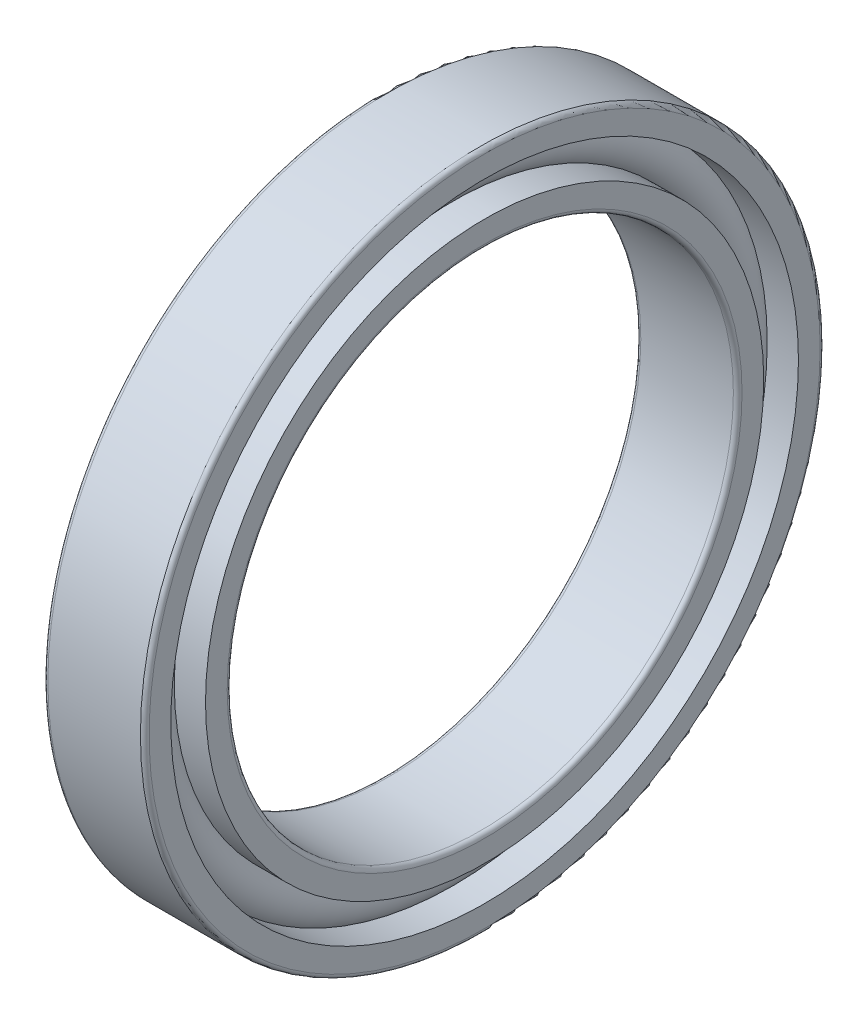
ISO-10303-21;
HEADER;
FILE_DESCRIPTION(('STEP AP214'),'2;1');
FILE_NAME('part.step','',(''),(''),'','','');
FILE_SCHEMA(('AUTOMOTIVE_DESIGN { 1 0 10303 214 1 1 1 1 }'));
ENDSEC;
DATA;
#1=APPLICATION_CONTEXT('core data for automotive mechanical design processes');
#2=APPLICATION_PROTOCOL_DEFINITION('international standard','automotive_design',2000,#1);
#3=PRODUCT_CONTEXT('',#1,'mechanical');
#4=PRODUCT('Part','Part','',(#3));
#5=PRODUCT_RELATED_PRODUCT_CATEGORY('part','',(#4));
#6=PRODUCT_DEFINITION_FORMATION('','',#4);
#7=PRODUCT_DEFINITION_CONTEXT('part definition',#1,'design');
#8=PRODUCT_DEFINITION('design','',#6,#7);
#9=PRODUCT_DEFINITION_SHAPE('','',#8);
#10=(LENGTH_UNIT() NAMED_UNIT(*) SI_UNIT(.MILLI.,.METRE.));
#11=(NAMED_UNIT(*) PLANE_ANGLE_UNIT() SI_UNIT($,.RADIAN.));
#12=(NAMED_UNIT(*) SI_UNIT($,.STERADIAN.) SOLID_ANGLE_UNIT());
#13=UNCERTAINTY_MEASURE_WITH_UNIT(LENGTH_MEASURE(1.E-05),#10,'distance_accuracy_value','');
#14=(GEOMETRIC_REPRESENTATION_CONTEXT(3) GLOBAL_UNCERTAINTY_ASSIGNED_CONTEXT((#13)) GLOBAL_UNIT_ASSIGNED_CONTEXT((#10,
#11,#12)) REPRESENTATION_CONTEXT('',''));
#15=CARTESIAN_POINT('',(0.,0.,0.));
#16=DIRECTION('',(0.,0.,1.));
#17=DIRECTION('',(1.,0.,0.));
#18=AXIS2_PLACEMENT_3D('',#15,#16,#17);
#19=CARTESIAN_POINT('',(0.,0.,0.));
#20=DIRECTION('',(-1.,0.,0.));
#21=DIRECTION('',(0.,0.,1.));
#22=AXIS2_PLACEMENT_3D('',#19,#20,#21);
#23=TOROIDAL_SURFACE('',#22,20.5,1.8);
#24=CARTESIAN_POINT('',(1.34164078649987,0.,0.));
#25=DIRECTION('',(-1.,0.,0.));
#26=DIRECTION('',(0.,0.,1.));
#27=AXIS2_PLACEMENT_3D('',#24,#25,#26);
#28=CIRCLE('',#27,21.7);
#29=CARTESIAN_POINT('',(1.34164078649987,0.,21.7));
#30=VERTEX_POINT('',#29);
#31=EDGE_CURVE('E36',#30,#30,#28,.F.);
#32=ORIENTED_EDGE('',*,*,#31,.T.);
#33=EDGE_LOOP('',(#32));
#34=FACE_BOUND('',#33,.T.);
#35=CARTESIAN_POINT('',(1.34164078649987,0.,0.));
#36=DIRECTION('',(-1.,0.,0.));
#37=DIRECTION('',(0.,0.,1.));
#38=AXIS2_PLACEMENT_3D('',#35,#36,#37);
#39=CIRCLE('',#38,19.3);
#40=CARTESIAN_POINT('',(1.34164078649987,0.,19.3));
#41=VERTEX_POINT('',#40);
#42=EDGE_CURVE('E10',#41,#41,#39,.T.);
#43=ORIENTED_EDGE('',*,*,#42,.T.);
#44=EDGE_LOOP('',(#43));
#45=FACE_BOUND('',#44,.T.);
#46=ADVANCED_FACE('F32',(#34,#45),#23,.T.);
#47=CARTESIAN_POINT('',(-20.6375,0.,0.));
#48=DIRECTION('',(1.,0.,0.));
#49=DIRECTION('',(0.,0.,-1.));
#50=AXIS2_PLACEMENT_3D('',#47,#48,#49);
#51=CYLINDRICAL_SURFACE('',#50,19.3);
#52=CARTESIAN_POINT('',(3.5,0.,0.));
#53=DIRECTION('',(1.,0.,0.));
#54=DIRECTION('',(0.,0.,-1.));
#55=AXIS2_PLACEMENT_3D('',#52,#53,#54);
#56=CIRCLE('',#55,19.3);
#57=CARTESIAN_POINT('',(3.5,0.,-19.3));
#58=VERTEX_POINT('',#57);
#59=EDGE_CURVE('E45',#58,#58,#56,.T.);
#60=ORIENTED_EDGE('',*,*,#59,.F.);
#61=EDGE_LOOP('',(#60));
#62=FACE_BOUND('',#61,.T.);
#63=ORIENTED_EDGE('',*,*,#42,.F.);
#64=EDGE_LOOP('',(#63));
#65=FACE_BOUND('',#64,.T.);
#66=ADVANCED_FACE('F84',(#62,#65),#51,.T.);
#67=CARTESIAN_POINT('',(-20.6375,0.,0.));
#68=DIRECTION('',(1.,0.,0.));
#69=DIRECTION('',(0.,0.,-1.));
#70=AXIS2_PLACEMENT_3D('',#67,#68,#69);
#71=CYLINDRICAL_SURFACE('',#70,19.3);
#72=CARTESIAN_POINT('',(-3.5,0.,0.));
#73=DIRECTION('',(1.,0.,0.));
#74=DIRECTION('',(0.,0.,-1.));
#75=AXIS2_PLACEMENT_3D('',#72,#73,#74);
#76=CIRCLE('',#75,19.3);
#77=CARTESIAN_POINT('',(-3.5,0.,-19.3));
#78=VERTEX_POINT('',#77);
#79=EDGE_CURVE('E54',#78,#78,#76,.T.);
#80=ORIENTED_EDGE('',*,*,#79,.T.);
#81=EDGE_LOOP('',(#80));
#82=FACE_BOUND('',#81,.T.);
#83=CARTESIAN_POINT('',(-1.34164078649987,0.,0.));
#84=DIRECTION('',(1.,0.,0.));
#85=DIRECTION('',(0.,0.,-1.));
#86=AXIS2_PLACEMENT_3D('',#83,#84,#85);
#87=CIRCLE('',#86,19.3);
#88=CARTESIAN_POINT('',(-1.34164078649987,0.,-19.3));
#89=VERTEX_POINT('',#88);
#90=EDGE_CURVE('E40',#89,#89,#87,.T.);
#91=ORIENTED_EDGE('',*,*,#90,.F.);
#92=EDGE_LOOP('',(#91));
#93=FACE_BOUND('',#92,.T.);
#94=ADVANCED_FACE('F87',(#82,#93),#71,.T.);
#95=CARTESIAN_POINT('',(3.5,17.8,0.));
#96=DIRECTION('',(1.,0.,0.));
#97=DIRECTION('',(0.,0.,-1.));
#98=AXIS2_PLACEMENT_3D('',#95,#96,#97);
#99=PLANE('',#98);
#100=ORIENTED_EDGE('',*,*,#59,.T.);
#101=EDGE_LOOP('',(#100));
#102=FACE_BOUND('',#101,.T.);
#103=CARTESIAN_POINT('',(3.5,0.,0.));
#104=DIRECTION('',(1.,0.,0.));
#105=DIRECTION('',(0.,0.,-1.));
#106=AXIS2_PLACEMENT_3D('',#103,#104,#105);
#107=CIRCLE('',#106,17.8);
#108=CARTESIAN_POINT('',(3.5,0.,-17.8));
#109=VERTEX_POINT('',#108);
#110=EDGE_CURVE('E76',#109,#109,#107,.T.);
#111=ORIENTED_EDGE('',*,*,#110,.F.);
#112=EDGE_LOOP('',(#111));
#113=FACE_BOUND('',#112,.T.);
#114=ADVANCED_FACE('F81',(#102,#113),#99,.T.);
#115=CARTESIAN_POINT('',(3.2,0.,0.));
#116=DIRECTION('',(1.,0.,0.));
#117=DIRECTION('',(0.,0.,-1.));
#118=AXIS2_PLACEMENT_3D('',#115,#116,#117);
#119=TOROIDAL_SURFACE('',#118,17.8,0.300000000000001);
#120=ORIENTED_EDGE('',*,*,#110,.T.);
#121=EDGE_LOOP('',(#120));
#122=FACE_BOUND('',#121,.T.);
#123=CARTESIAN_POINT('',(3.2,0.,0.));
#124=DIRECTION('',(1.,0.,0.));
#125=DIRECTION('',(0.,0.,-1.));
#126=AXIS2_PLACEMENT_3D('',#123,#124,#125);
#127=CIRCLE('',#126,17.5);
#128=CARTESIAN_POINT('',(3.2,0.,-17.5));
#129=VERTEX_POINT('',#128);
#130=EDGE_CURVE('E73',#129,#129,#127,.T.);
#131=ORIENTED_EDGE('',*,*,#130,.F.);
#132=EDGE_LOOP('',(#131));
#133=FACE_BOUND('',#132,.T.);
#134=ADVANCED_FACE('F98',(#122,#133),#119,.T.);
#135=CARTESIAN_POINT('',(-20.6375,0.,0.));
#136=DIRECTION('',(1.,0.,0.));
#137=DIRECTION('',(0.,0.,-1.));
#138=AXIS2_PLACEMENT_3D('',#135,#136,#137);
#139=CYLINDRICAL_SURFACE('',#138,17.5);
#140=ORIENTED_EDGE('',*,*,#130,.T.);
#141=EDGE_LOOP('',(#140));
#142=FACE_BOUND('',#141,.T.);
#143=CARTESIAN_POINT('',(-3.2,0.,0.));
#144=DIRECTION('',(1.,0.,0.));
#145=DIRECTION('',(0.,0.,-1.));
#146=AXIS2_PLACEMENT_3D('',#143,#144,#145);
#147=CIRCLE('',#146,17.5);
#148=CARTESIAN_POINT('',(-3.2,0.,-17.5));
#149=VERTEX_POINT('',#148);
#150=EDGE_CURVE('E70',#149,#149,#147,.T.);
#151=ORIENTED_EDGE('',*,*,#150,.F.);
#152=EDGE_LOOP('',(#151));
#153=FACE_BOUND('',#152,.T.);
#154=ADVANCED_FACE('F101',(#142,#153),#139,.F.);
#155=CARTESIAN_POINT('',(-3.2,0.,0.));
#156=DIRECTION('',(1.,0.,0.));
#157=DIRECTION('',(0.,0.,-1.));
#158=AXIS2_PLACEMENT_3D('',#155,#156,#157);
#159=TOROIDAL_SURFACE('',#158,17.8,0.300000000000001);
#160=ORIENTED_EDGE('',*,*,#150,.T.);
#161=EDGE_LOOP('',(#160));
#162=FACE_BOUND('',#161,.T.);
#163=CARTESIAN_POINT('',(-3.5,0.,0.));
#164=DIRECTION('',(1.,0.,0.));
#165=DIRECTION('',(0.,0.,-1.));
#166=AXIS2_PLACEMENT_3D('',#163,#164,#165);
#167=CIRCLE('',#166,17.8);
#168=CARTESIAN_POINT('',(-3.5,0.,-17.8));
#169=VERTEX_POINT('',#168);
#170=EDGE_CURVE('E67',#169,#169,#167,.T.);
#171=ORIENTED_EDGE('',*,*,#170,.F.);
#172=EDGE_LOOP('',(#171));
#173=FACE_BOUND('',#172,.T.);
#174=ADVANCED_FACE('F105',(#162,#173),#159,.T.);
#175=CARTESIAN_POINT('',(-3.5,19.3,0.));
#176=DIRECTION('',(-1.,0.,0.));
#177=DIRECTION('',(0.,0.,1.));
#178=AXIS2_PLACEMENT_3D('',#175,#176,#177);
#179=PLANE('',#178);
#180=ORIENTED_EDGE('',*,*,#170,.T.);
#181=EDGE_LOOP('',(#180));
#182=FACE_BOUND('',#181,.T.);
#183=ORIENTED_EDGE('',*,*,#79,.F.);
#184=EDGE_LOOP('',(#183));
#185=FACE_BOUND('',#184,.T.);
#186=ADVANCED_FACE('F109',(#182,#185),#179,.T.);
#187=CARTESIAN_POINT('',(-1.34164078649987,0.,0.));
#188=DIRECTION('',(1.,0.,0.));
#189=DIRECTION('',(0.,0.,-1.));
#190=AXIS2_PLACEMENT_3D('',#187,#188,#189);
#191=CIRCLE('',#190,21.7);
#192=CARTESIAN_POINT('',(-1.34164078649987,0.,-21.7));
#193=VERTEX_POINT('',#192);
#194=EDGE_CURVE('E48',#193,#193,#191,.F.);
#195=ORIENTED_EDGE('',*,*,#194,.T.);
#196=EDGE_LOOP('',(#195));
#197=FACE_BOUND('',#196,.T.);
#198=ORIENTED_EDGE('',*,*,#90,.T.);
#199=EDGE_LOOP('',(#198));
#200=FACE_BOUND('',#199,.T.);
#201=ADVANCED_FACE('F34',(#197,#200),#23,.T.);
#202=CARTESIAN_POINT('',(-20.6375,0.,0.));
#203=DIRECTION('',(1.,0.,0.));
#204=DIRECTION('',(0.,0.,-1.));
#205=AXIS2_PLACEMENT_3D('',#202,#203,#204);
#206=CYLINDRICAL_SURFACE('',#205,21.7);
#207=CARTESIAN_POINT('',(3.5,0.,0.));
#208=DIRECTION('',(1.,0.,0.));
#209=DIRECTION('',(0.,0.,-1.));
#210=AXIS2_PLACEMENT_3D('',#207,#208,#209);
#211=CIRCLE('',#210,21.7);
#212=CARTESIAN_POINT('',(3.5,0.,-21.7));
#213=VERTEX_POINT('',#212);
#214=EDGE_CURVE('E50',#213,#213,#211,.T.);
#215=ORIENTED_EDGE('',*,*,#214,.T.);
#216=EDGE_LOOP('',(#215));
#217=FACE_BOUND('',#216,.T.);
#218=ORIENTED_EDGE('',*,*,#31,.F.);
#219=EDGE_LOOP('',(#218));
#220=FACE_BOUND('',#219,.T.);
#221=ADVANCED_FACE('F114',(#217,#220),#206,.F.);
#222=CARTESIAN_POINT('',(-20.6375,0.,0.));
#223=DIRECTION('',(1.,0.,0.));
#224=DIRECTION('',(0.,0.,-1.));
#225=AXIS2_PLACEMENT_3D('',#222,#223,#224);
#226=CYLINDRICAL_SURFACE('',#225,21.7);
#227=CARTESIAN_POINT('',(-3.5,0.,0.));
#228=DIRECTION('',(1.,0.,0.));
#229=DIRECTION('',(0.,0.,-1.));
#230=AXIS2_PLACEMENT_3D('',#227,#228,#229);
#231=CIRCLE('',#230,21.7);
#232=CARTESIAN_POINT('',(-3.5,0.,-21.7));
#233=VERTEX_POINT('',#232);
#234=EDGE_CURVE('E145',#233,#233,#231,.T.);
#235=ORIENTED_EDGE('',*,*,#234,.F.);
#236=EDGE_LOOP('',(#235));
#237=FACE_BOUND('',#236,.T.);
#238=ORIENTED_EDGE('',*,*,#194,.F.);
#239=EDGE_LOOP('',(#238));
#240=FACE_BOUND('',#239,.T.);
#241=ADVANCED_FACE('F117',(#237,#240),#226,.F.);
#242=CARTESIAN_POINT('',(3.50000000000001,23.2,0.));
#243=DIRECTION('',(1.,0.,0.));
#244=DIRECTION('',(0.,0.,-1.));
#245=AXIS2_PLACEMENT_3D('',#242,#243,#244);
#246=PLANE('',#245);
#247=CARTESIAN_POINT('',(3.50000000000001,0.,0.));
#248=DIRECTION('',(1.,0.,0.));
#249=DIRECTION('',(0.,0.,-1.));
#250=AXIS2_PLACEMENT_3D('',#247,#248,#249);
#251=CIRCLE('',#250,23.2);
#252=CARTESIAN_POINT('',(3.50000000000001,0.,-23.2));
#253=VERTEX_POINT('',#252);
#254=EDGE_CURVE('E56',#253,#253,#251,.T.);
#255=ORIENTED_EDGE('',*,*,#254,.T.);
#256=EDGE_LOOP('',(#255));
#257=FACE_BOUND('',#256,.T.);
#258=ORIENTED_EDGE('',*,*,#214,.F.);
#259=EDGE_LOOP('',(#258));
#260=FACE_BOUND('',#259,.T.);
#261=ADVANCED_FACE('F118',(#257,#260),#246,.T.);
#262=CARTESIAN_POINT('',(3.2,0.,0.));
#263=DIRECTION('',(1.,0.,0.));
#264=DIRECTION('',(0.,0.,-1.));
#265=AXIS2_PLACEMENT_3D('',#262,#263,#264);
#266=TOROIDAL_SURFACE('',#265,23.2,0.300000000000006);
#267=CARTESIAN_POINT('',(3.2,0.,0.));
#268=DIRECTION('',(1.,0.,0.));
#269=DIRECTION('',(0.,0.,-1.));
#270=AXIS2_PLACEMENT_3D('',#267,#268,#269);
#271=CIRCLE('',#270,23.5);
#272=CARTESIAN_POINT('',(3.2,0.,-23.5));
#273=VERTEX_POINT('',#272);
#274=EDGE_CURVE('E61',#273,#273,#271,.T.);
#275=ORIENTED_EDGE('',*,*,#274,.T.);
#276=EDGE_LOOP('',(#275));
#277=FACE_BOUND('',#276,.T.);
#278=ORIENTED_EDGE('',*,*,#254,.F.);
#279=EDGE_LOOP('',(#278));
#280=FACE_BOUND('',#279,.T.);
#281=ADVANCED_FACE('F121',(#277,#280),#266,.T.);
#282=CARTESIAN_POINT('',(-20.6375,0.,0.));
#283=DIRECTION('',(1.,0.,0.));
#284=DIRECTION('',(0.,0.,-1.));
#285=AXIS2_PLACEMENT_3D('',#282,#283,#284);
#286=CYLINDRICAL_SURFACE('',#285,23.5);
#287=CARTESIAN_POINT('',(-3.2,0.,0.));
#288=DIRECTION('',(1.,0.,0.));
#289=DIRECTION('',(0.,0.,-1.));
#290=AXIS2_PLACEMENT_3D('',#287,#288,#289);
#291=CIRCLE('',#290,23.5);
#292=CARTESIAN_POINT('',(-3.2,0.,-23.5));
#293=VERTEX_POINT('',#292);
#294=EDGE_CURVE('E149',#293,#293,#291,.T.);
#295=ORIENTED_EDGE('',*,*,#294,.T.);
#296=EDGE_LOOP('',(#295));
#297=FACE_BOUND('',#296,.T.);
#298=ORIENTED_EDGE('',*,*,#274,.F.);
#299=EDGE_LOOP('',(#298));
#300=FACE_BOUND('',#299,.T.);
#301=ADVANCED_FACE('F125',(#297,#300),#286,.T.);
#302=CARTESIAN_POINT('',(-3.2,0.,0.));
#303=DIRECTION('',(1.,0.,0.));
#304=DIRECTION('',(0.,0.,-1.));
#305=AXIS2_PLACEMENT_3D('',#302,#303,#304);
#306=TOROIDAL_SURFACE('',#305,23.2,0.300000000000006);
#307=CARTESIAN_POINT('',(-3.5,0.,0.));
#308=DIRECTION('',(1.,0.,0.));
#309=DIRECTION('',(0.,0.,-1.));
#310=AXIS2_PLACEMENT_3D('',#307,#308,#309);
#311=CIRCLE('',#310,23.2);
#312=CARTESIAN_POINT('',(-3.5,0.,-23.2));
#313=VERTEX_POINT('',#312);
#314=EDGE_CURVE('E146',#313,#313,#311,.T.);
#315=ORIENTED_EDGE('',*,*,#314,.T.);
#316=EDGE_LOOP('',(#315));
#317=FACE_BOUND('',#316,.T.);
#318=ORIENTED_EDGE('',*,*,#294,.F.);
#319=EDGE_LOOP('',(#318));
#320=FACE_BOUND('',#319,.T.);
#321=ADVANCED_FACE('F129',(#317,#320),#306,.T.);
#322=CARTESIAN_POINT('',(-3.5,21.7,0.));
#323=DIRECTION('',(-1.,0.,0.));
#324=DIRECTION('',(0.,0.,1.));
#325=AXIS2_PLACEMENT_3D('',#322,#323,#324);
#326=PLANE('',#325);
#327=ORIENTED_EDGE('',*,*,#234,.T.);
#328=EDGE_LOOP('',(#327));
#329=FACE_BOUND('',#328,.T.);
#330=ORIENTED_EDGE('',*,*,#314,.F.);
#331=EDGE_LOOP('',(#330));
#332=FACE_BOUND('',#331,.T.);
#333=ADVANCED_FACE('F133',(#329,#332),#326,.T.);
#334=CLOSED_SHELL('',(#46,#66,#94,#114,#134,#154,#174,#186,#201,#221,#241,#261,#281,#301,#321,#333));
#335=MANIFOLD_SOLID_BREP('B2',#334);
#336=ADVANCED_BREP_SHAPE_REPRESENTATION('',(#18,#335),#14);
#337=SHAPE_DEFINITION_REPRESENTATION(#9,#336);
ENDSEC;
END-ISO-10303-21;
